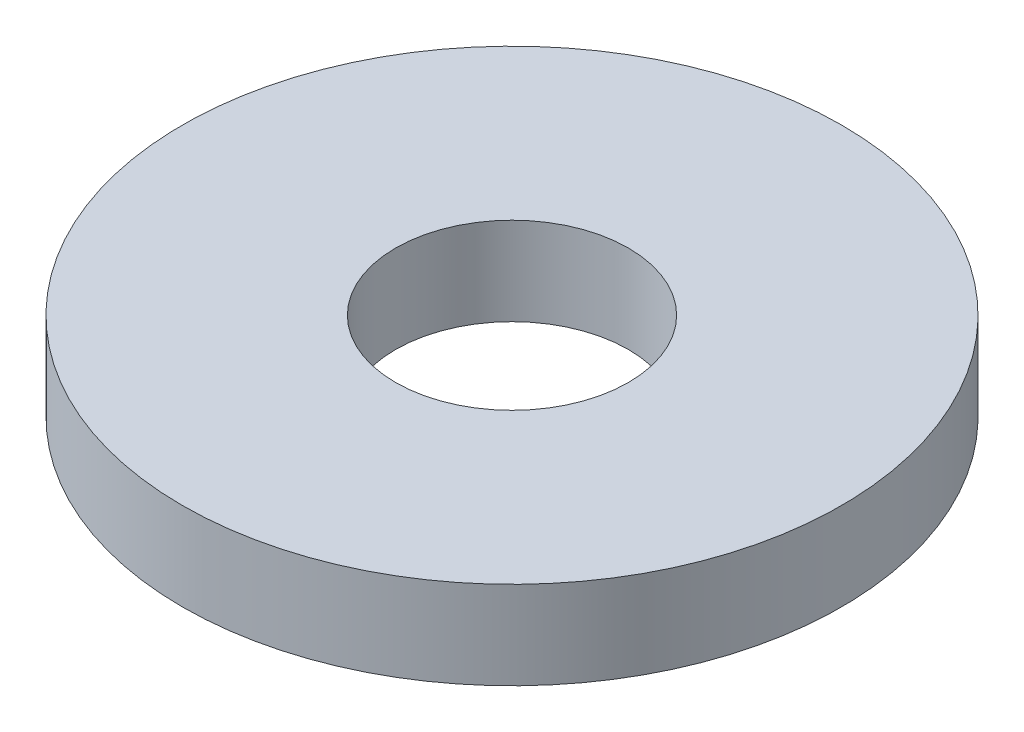
ISO-10303-21;
HEADER;
FILE_DESCRIPTION(('STEP AP214'),'2;1');
FILE_NAME('part.step','',(''),(''),'','','');
FILE_SCHEMA(('AUTOMOTIVE_DESIGN { 1 0 10303 214 1 1 1 1 }'));
ENDSEC;
DATA;
#1=APPLICATION_CONTEXT('core data for automotive mechanical design processes');
#2=APPLICATION_PROTOCOL_DEFINITION('international standard','automotive_design',2000,#1);
#3=PRODUCT_CONTEXT('',#1,'mechanical');
#4=PRODUCT('Part','Part','',(#3));
#5=PRODUCT_RELATED_PRODUCT_CATEGORY('part','',(#4));
#6=PRODUCT_DEFINITION_FORMATION('','',#4);
#7=PRODUCT_DEFINITION_CONTEXT('part definition',#1,'design');
#8=PRODUCT_DEFINITION('design','',#6,#7);
#9=PRODUCT_DEFINITION_SHAPE('','',#8);
#10=(LENGTH_UNIT() NAMED_UNIT(*) SI_UNIT(.MILLI.,.METRE.));
#11=(NAMED_UNIT(*) PLANE_ANGLE_UNIT() SI_UNIT($,.RADIAN.));
#12=(NAMED_UNIT(*) SI_UNIT($,.STERADIAN.) SOLID_ANGLE_UNIT());
#13=UNCERTAINTY_MEASURE_WITH_UNIT(LENGTH_MEASURE(1.E-05),#10,'distance_accuracy_value','');
#14=(GEOMETRIC_REPRESENTATION_CONTEXT(3) GLOBAL_UNCERTAINTY_ASSIGNED_CONTEXT((#13)) GLOBAL_UNIT_ASSIGNED_CONTEXT((#10,
#11,#12)) REPRESENTATION_CONTEXT('',''));
#15=CARTESIAN_POINT('',(0.,0.,0.));
#16=DIRECTION('',(0.,0.,1.));
#17=DIRECTION('',(1.,0.,0.));
#18=AXIS2_PLACEMENT_3D('',#15,#16,#17);
#19=CARTESIAN_POINT('',(0.,2.,0.));
#20=DIRECTION('',(0.,1.,0.));
#21=DIRECTION('',(0.,0.,1.));
#22=AXIS2_PLACEMENT_3D('',#19,#20,#21);
#23=PLANE('',#22);
#24=CARTESIAN_POINT('',(0.,2.,0.));
#25=DIRECTION('',(0.,1.,0.));
#26=DIRECTION('',(0.,0.,1.));
#27=AXIS2_PLACEMENT_3D('',#24,#25,#26);
#28=CIRCLE('',#27,7.5);
#29=CARTESIAN_POINT('',(0.,2.,7.5));
#30=VERTEX_POINT('',#29);
#31=EDGE_CURVE('E10',#30,#30,#28,.T.);
#32=ORIENTED_EDGE('',*,*,#31,.T.);
#33=EDGE_LOOP('',(#32));
#34=FACE_BOUND('',#33,.T.);
#35=CARTESIAN_POINT('',(0.,2.,0.));
#36=DIRECTION('',(0.,1.,0.));
#37=DIRECTION('',(0.,0.,1.));
#38=AXIS2_PLACEMENT_3D('',#35,#36,#37);
#39=CIRCLE('',#38,2.65);
#40=CARTESIAN_POINT('',(0.,2.,2.65));
#41=VERTEX_POINT('',#40);
#42=EDGE_CURVE('E50',#41,#41,#39,.T.);
#43=ORIENTED_EDGE('',*,*,#42,.F.);
#44=EDGE_LOOP('',(#43));
#45=FACE_BOUND('',#44,.T.);
#46=ADVANCED_FACE('F39',(#34,#45),#23,.T.);
#47=CARTESIAN_POINT('',(0.,0.,0.));
#48=DIRECTION('',(0.,1.,0.));
#49=DIRECTION('',(0.,0.,1.));
#50=AXIS2_PLACEMENT_3D('',#47,#48,#49);
#51=PLANE('',#50);
#52=CARTESIAN_POINT('',(0.,0.,0.));
#53=DIRECTION('',(0.,1.,0.));
#54=DIRECTION('',(0.,0.,1.));
#55=AXIS2_PLACEMENT_3D('',#52,#53,#54);
#56=CIRCLE('',#55,7.5);
#57=CARTESIAN_POINT('',(0.,0.,7.5));
#58=VERTEX_POINT('',#57);
#59=EDGE_CURVE('E43',#58,#58,#56,.T.);
#60=ORIENTED_EDGE('',*,*,#59,.F.);
#61=EDGE_LOOP('',(#60));
#62=FACE_BOUND('',#61,.T.);
#63=CARTESIAN_POINT('',(0.,0.,0.));
#64=DIRECTION('',(0.,1.,0.));
#65=DIRECTION('',(0.,0.,1.));
#66=AXIS2_PLACEMENT_3D('',#63,#64,#65);
#67=CIRCLE('',#66,2.65);
#68=CARTESIAN_POINT('',(0.,0.,2.65));
#69=VERTEX_POINT('',#68);
#70=EDGE_CURVE('E52',#69,#69,#67,.T.);
#71=ORIENTED_EDGE('',*,*,#70,.T.);
#72=EDGE_LOOP('',(#71));
#73=FACE_BOUND('',#72,.T.);
#74=ADVANCED_FACE('F62',(#62,#73),#51,.F.);
#75=CARTESIAN_POINT('',(0.,2.,0.));
#76=DIRECTION('',(0.,-1.,0.));
#77=DIRECTION('',(0.,0.,-1.));
#78=AXIS2_PLACEMENT_3D('',#75,#76,#77);
#79=CYLINDRICAL_SURFACE('',#78,7.5);
#80=ORIENTED_EDGE('',*,*,#31,.F.);
#81=EDGE_LOOP('',(#80));
#82=FACE_BOUND('',#81,.T.);
#83=ORIENTED_EDGE('',*,*,#59,.T.);
#84=EDGE_LOOP('',(#83));
#85=FACE_BOUND('',#84,.T.);
#86=ADVANCED_FACE('F41',(#82,#85),#79,.T.);
#87=CARTESIAN_POINT('',(0.,2.,0.));
#88=DIRECTION('',(0.,-1.,0.));
#89=DIRECTION('',(0.,0.,-1.));
#90=AXIS2_PLACEMENT_3D('',#87,#88,#89);
#91=CYLINDRICAL_SURFACE('',#90,2.65);
#92=ORIENTED_EDGE('',*,*,#42,.T.);
#93=EDGE_LOOP('',(#92));
#94=FACE_BOUND('',#93,.T.);
#95=ORIENTED_EDGE('',*,*,#70,.F.);
#96=EDGE_LOOP('',(#95));
#97=FACE_BOUND('',#96,.T.);
#98=ADVANCED_FACE('F58',(#94,#97),#91,.F.);
#99=CLOSED_SHELL('',(#46,#74,#86,#98));
#100=MANIFOLD_SOLID_BREP('B2',#99);
#101=ADVANCED_BREP_SHAPE_REPRESENTATION('',(#18,#100),#14);
#102=SHAPE_DEFINITION_REPRESENTATION(#9,#101);
ENDSEC;
END-ISO-10303-21;
